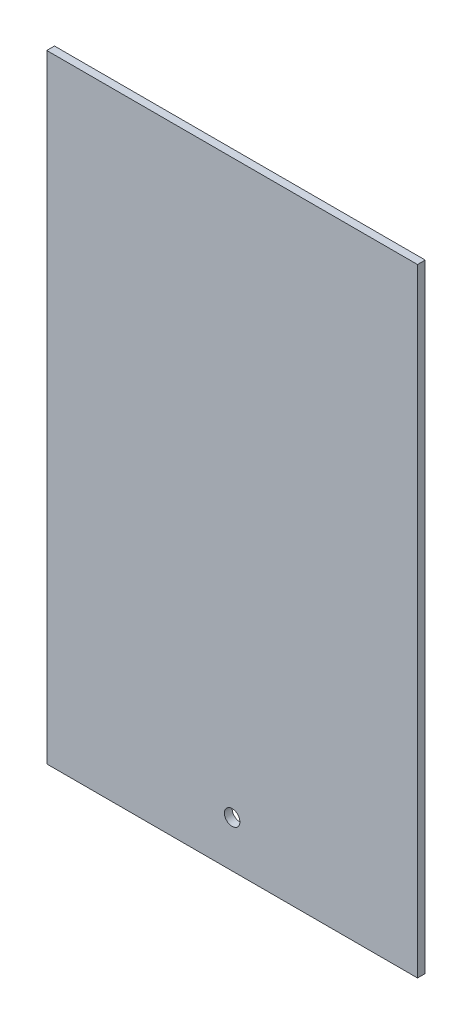
ISO-10303-21;
HEADER;
FILE_DESCRIPTION(('STEP AP214'),'2;1');
FILE_NAME('part.step','',(''),(''),'','','');
FILE_SCHEMA(('AUTOMOTIVE_DESIGN { 1 0 10303 214 1 1 1 1 }'));
ENDSEC;
DATA;
#1=APPLICATION_CONTEXT('core data for automotive mechanical design processes');
#2=APPLICATION_PROTOCOL_DEFINITION('international standard','automotive_design',2000,#1);
#3=PRODUCT_CONTEXT('',#1,'mechanical');
#4=PRODUCT('Part','Part','',(#3));
#5=PRODUCT_RELATED_PRODUCT_CATEGORY('part','',(#4));
#6=PRODUCT_DEFINITION_FORMATION('','',#4);
#7=PRODUCT_DEFINITION_CONTEXT('part definition',#1,'design');
#8=PRODUCT_DEFINITION('design','',#6,#7);
#9=PRODUCT_DEFINITION_SHAPE('','',#8);
#10=(LENGTH_UNIT() NAMED_UNIT(*) SI_UNIT(.MILLI.,.METRE.));
#11=(NAMED_UNIT(*) PLANE_ANGLE_UNIT() SI_UNIT($,.RADIAN.));
#12=(NAMED_UNIT(*) SI_UNIT($,.STERADIAN.) SOLID_ANGLE_UNIT());
#13=UNCERTAINTY_MEASURE_WITH_UNIT(LENGTH_MEASURE(1.E-05),#10,'distance_accuracy_value','');
#14=(GEOMETRIC_REPRESENTATION_CONTEXT(3) GLOBAL_UNCERTAINTY_ASSIGNED_CONTEXT((#13)) GLOBAL_UNIT_ASSIGNED_CONTEXT((#10,
#11,#12)) REPRESENTATION_CONTEXT('',''));
#15=CARTESIAN_POINT('',(0.,0.,0.));
#16=DIRECTION('',(0.,0.,1.));
#17=DIRECTION('',(1.,0.,0.));
#18=AXIS2_PLACEMENT_3D('',#15,#16,#17);
#19=CARTESIAN_POINT('',(76.2,-127.,3.175));
#20=DIRECTION('',(-1.,0.,0.));
#21=DIRECTION('',(0.,0.,1.));
#22=AXIS2_PLACEMENT_3D('',#19,#20,#21);
#23=PLANE('',#22);
#24=DIRECTION('',(0.,1.,0.));
#25=VECTOR('',#24,1.);
#26=CARTESIAN_POINT('',(76.2,-127.,0.));
#27=LINE('',#26,#25);
#28=CARTESIAN_POINT('',(76.2,-127.,0.));
#29=VERTEX_POINT('',#28);
#30=CARTESIAN_POINT('',(76.2,127.,0.));
#31=VERTEX_POINT('',#30);
#32=EDGE_CURVE('E108',#29,#31,#27,.T.);
#33=ORIENTED_EDGE('',*,*,#32,.T.);
#34=DIRECTION('',(0.,0.,-1.));
#35=VECTOR('',#34,1.);
#36=CARTESIAN_POINT('',(76.2,127.,3.175));
#37=LINE('',#36,#35);
#38=CARTESIAN_POINT('',(76.2,127.,3.175));
#39=VERTEX_POINT('',#38);
#40=EDGE_CURVE('E11',#39,#31,#37,.T.);
#41=ORIENTED_EDGE('',*,*,#40,.F.);
#42=DIRECTION('',(0.,1.,0.));
#43=VECTOR('',#42,1.);
#44=CARTESIAN_POINT('',(76.2,-127.,3.175));
#45=LINE('',#44,#43);
#46=CARTESIAN_POINT('',(76.2,-127.,3.175));
#47=VERTEX_POINT('',#46);
#48=EDGE_CURVE('E96',#47,#39,#45,.T.);
#49=ORIENTED_EDGE('',*,*,#48,.F.);
#50=DIRECTION('',(0.,0.,-1.));
#51=VECTOR('',#50,1.);
#52=CARTESIAN_POINT('',(76.2,-127.,3.175));
#53=LINE('',#52,#51);
#54=EDGE_CURVE('E104',#47,#29,#53,.T.);
#55=ORIENTED_EDGE('',*,*,#54,.T.);
#56=EDGE_LOOP('',(#33,#41,#49,#55));
#57=FACE_BOUND('',#56,.T.);
#58=ADVANCED_FACE('F45',(#57),#23,.F.);
#59=CARTESIAN_POINT('',(-76.2,127.,3.175));
#60=DIRECTION('',(0.,-1.,0.));
#61=DIRECTION('',(0.,0.,-1.));
#62=AXIS2_PLACEMENT_3D('',#59,#60,#61);
#63=PLANE('',#62);
#64=DIRECTION('',(-1.,0.,0.));
#65=VECTOR('',#64,1.);
#66=CARTESIAN_POINT('',(-76.2,127.,0.));
#67=LINE('',#66,#65);
#68=CARTESIAN_POINT('',(-76.2,127.,0.));
#69=VERTEX_POINT('',#68);
#70=EDGE_CURVE('E100',#31,#69,#67,.T.);
#71=ORIENTED_EDGE('',*,*,#70,.T.);
#72=DIRECTION('',(0.,0.,-1.));
#73=VECTOR('',#72,1.);
#74=CARTESIAN_POINT('',(-76.2,127.,3.175));
#75=LINE('',#74,#73);
#76=CARTESIAN_POINT('',(-76.2,127.,3.175));
#77=VERTEX_POINT('',#76);
#78=EDGE_CURVE('E53',#77,#69,#75,.T.);
#79=ORIENTED_EDGE('',*,*,#78,.F.);
#80=DIRECTION('',(-1.,0.,0.));
#81=VECTOR('',#80,1.);
#82=CARTESIAN_POINT('',(-76.2,127.,3.175));
#83=LINE('',#82,#81);
#84=EDGE_CURVE('E91',#39,#77,#83,.T.);
#85=ORIENTED_EDGE('',*,*,#84,.F.);
#86=ORIENTED_EDGE('',*,*,#40,.T.);
#87=EDGE_LOOP('',(#71,#79,#85,#86));
#88=FACE_BOUND('',#87,.T.);
#89=ADVANCED_FACE('F99',(#88),#63,.F.);
#90=CARTESIAN_POINT('',(-76.2,-127.,3.175));
#91=DIRECTION('',(1.,0.,0.));
#92=DIRECTION('',(0.,0.,-1.));
#93=AXIS2_PLACEMENT_3D('',#90,#91,#92);
#94=PLANE('',#93);
#95=DIRECTION('',(0.,-1.,0.));
#96=VECTOR('',#95,1.);
#97=CARTESIAN_POINT('',(-76.2,-127.,0.));
#98=LINE('',#97,#96);
#99=CARTESIAN_POINT('',(-76.2,-127.,0.));
#100=VERTEX_POINT('',#99);
#101=EDGE_CURVE('E78',#69,#100,#98,.T.);
#102=ORIENTED_EDGE('',*,*,#101,.T.);
#103=DIRECTION('',(0.,0.,-1.));
#104=VECTOR('',#103,1.);
#105=CARTESIAN_POINT('',(-76.2,-127.,3.175));
#106=LINE('',#105,#104);
#107=CARTESIAN_POINT('',(-76.2,-127.,3.175));
#108=VERTEX_POINT('',#107);
#109=EDGE_CURVE('E101',#108,#100,#106,.T.);
#110=ORIENTED_EDGE('',*,*,#109,.F.);
#111=DIRECTION('',(0.,-1.,0.));
#112=VECTOR('',#111,1.);
#113=CARTESIAN_POINT('',(-76.2,-127.,3.175));
#114=LINE('',#113,#112);
#115=EDGE_CURVE('E94',#77,#108,#114,.T.);
#116=ORIENTED_EDGE('',*,*,#115,.F.);
#117=ORIENTED_EDGE('',*,*,#78,.T.);
#118=EDGE_LOOP('',(#102,#110,#116,#117));
#119=FACE_BOUND('',#118,.T.);
#120=ADVANCED_FACE('F102',(#119),#94,.F.);
#121=CARTESIAN_POINT('',(-76.2,-127.,3.175));
#122=DIRECTION('',(0.,1.,0.));
#123=DIRECTION('',(0.,0.,1.));
#124=AXIS2_PLACEMENT_3D('',#121,#122,#123);
#125=PLANE('',#124);
#126=DIRECTION('',(1.,0.,0.));
#127=VECTOR('',#126,1.);
#128=CARTESIAN_POINT('',(-76.2,-127.,0.));
#129=LINE('',#128,#127);
#130=EDGE_CURVE('E84',#100,#29,#129,.T.);
#131=ORIENTED_EDGE('',*,*,#130,.T.);
#132=ORIENTED_EDGE('',*,*,#54,.F.);
#133=DIRECTION('',(1.,0.,0.));
#134=VECTOR('',#133,1.);
#135=CARTESIAN_POINT('',(-76.2,-127.,3.175));
#136=LINE('',#135,#134);
#137=EDGE_CURVE('E61',#108,#47,#136,.T.);
#138=ORIENTED_EDGE('',*,*,#137,.F.);
#139=ORIENTED_EDGE('',*,*,#109,.T.);
#140=EDGE_LOOP('',(#131,#132,#138,#139));
#141=FACE_BOUND('',#140,.T.);
#142=ADVANCED_FACE('F116',(#141),#125,.F.);
#143=CARTESIAN_POINT('',(0.,0.,3.175));
#144=DIRECTION('',(0.,0.,-1.));
#145=DIRECTION('',(-1.,0.,0.));
#146=AXIS2_PLACEMENT_3D('',#143,#144,#145);
#147=PLANE('',#146);
#148=CARTESIAN_POINT('',(0.,-107.95,3.175));
#149=DIRECTION('',(0.,0.,1.));
#150=DIRECTION('',(1.,0.,0.));
#151=AXIS2_PLACEMENT_3D('',#148,#149,#150);
#152=CIRCLE('',#151,3.175);
#153=CARTESIAN_POINT('',(3.175,-107.95,3.175));
#154=VERTEX_POINT('',#153);
#155=EDGE_CURVE('E122',#154,#154,#152,.T.);
#156=ORIENTED_EDGE('',*,*,#155,.F.);
#157=EDGE_LOOP('',(#156));
#158=FACE_BOUND('',#157,.T.);
#159=ORIENTED_EDGE('',*,*,#48,.T.);
#160=ORIENTED_EDGE('',*,*,#84,.T.);
#161=ORIENTED_EDGE('',*,*,#115,.T.);
#162=ORIENTED_EDGE('',*,*,#137,.T.);
#163=EDGE_LOOP('',(#159,#160,#161,#162));
#164=FACE_BOUND('',#163,.T.);
#165=ADVANCED_FACE('F92',(#158,#164),#147,.F.);
#166=CARTESIAN_POINT('',(0.,0.,0.));
#167=DIRECTION('',(0.,0.,-1.));
#168=DIRECTION('',(-1.,0.,0.));
#169=AXIS2_PLACEMENT_3D('',#166,#167,#168);
#170=PLANE('',#169);
#171=CARTESIAN_POINT('',(0.,-107.95,0.));
#172=DIRECTION('',(0.,0.,1.));
#173=DIRECTION('',(1.,0.,0.));
#174=AXIS2_PLACEMENT_3D('',#171,#172,#173);
#175=CIRCLE('',#174,3.175);
#176=CARTESIAN_POINT('',(3.175,-107.95,0.));
#177=VERTEX_POINT('',#176);
#178=EDGE_CURVE('E111',#177,#177,#175,.T.);
#179=ORIENTED_EDGE('',*,*,#178,.T.);
#180=EDGE_LOOP('',(#179));
#181=FACE_BOUND('',#180,.T.);
#182=ORIENTED_EDGE('',*,*,#32,.F.);
#183=ORIENTED_EDGE('',*,*,#130,.F.);
#184=ORIENTED_EDGE('',*,*,#101,.F.);
#185=ORIENTED_EDGE('',*,*,#70,.F.);
#186=EDGE_LOOP('',(#182,#183,#184,#185));
#187=FACE_BOUND('',#186,.T.);
#188=ADVANCED_FACE('F119',(#181,#187),#170,.T.);
#189=CARTESIAN_POINT('',(0.,-107.95,0.));
#190=DIRECTION('',(0.,0.,1.));
#191=DIRECTION('',(1.,0.,0.));
#192=AXIS2_PLACEMENT_3D('',#189,#190,#191);
#193=CYLINDRICAL_SURFACE('',#192,3.175);
#194=ORIENTED_EDGE('',*,*,#178,.F.);
#195=EDGE_LOOP('',(#194));
#196=FACE_BOUND('',#195,.T.);
#197=ORIENTED_EDGE('',*,*,#155,.T.);
#198=EDGE_LOOP('',(#197));
#199=FACE_BOUND('',#198,.T.);
#200=ADVANCED_FACE('F129',(#196,#199),#193,.F.);
#201=CLOSED_SHELL('',(#58,#89,#120,#142,#165,#188,#200));
#202=MANIFOLD_SOLID_BREP('B2',#201);
#203=ADVANCED_BREP_SHAPE_REPRESENTATION('',(#18,#202),#14);
#204=SHAPE_DEFINITION_REPRESENTATION(#9,#203);
ENDSEC;
END-ISO-10303-21;
